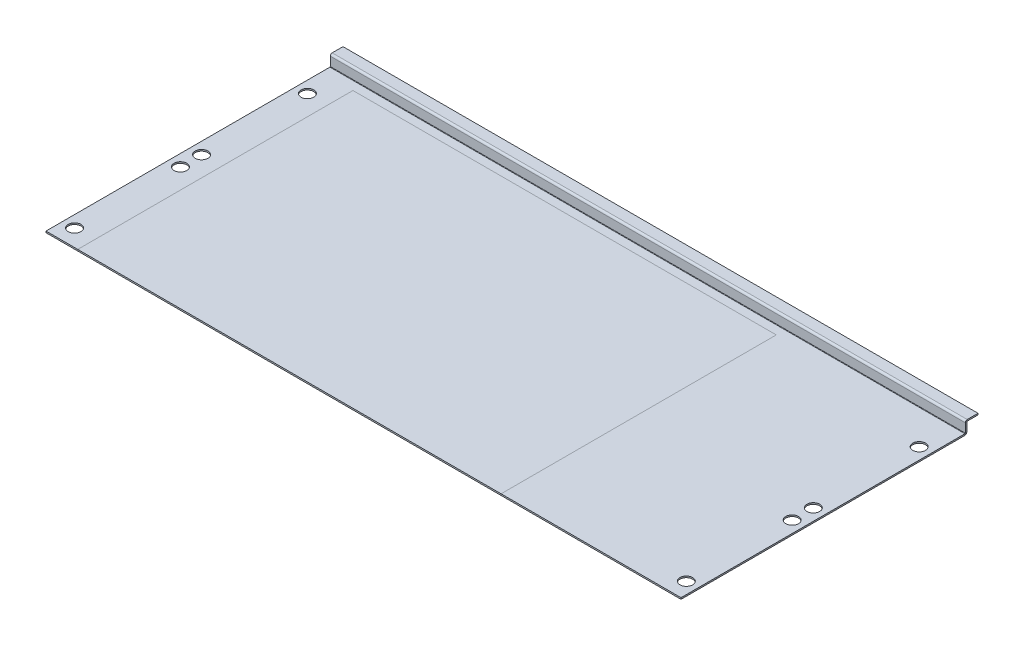
ISO-10303-21;
HEADER;
FILE_DESCRIPTION(('STEP AP214'),'2;1');
FILE_NAME('part.step','',(''),(''),'','','');
FILE_SCHEMA(('AUTOMOTIVE_DESIGN { 1 0 10303 214 1 1 1 1 }'));
ENDSEC;
DATA;
#1=APPLICATION_CONTEXT('core data for automotive mechanical design processes');
#2=APPLICATION_PROTOCOL_DEFINITION('international standard','automotive_design',2000,#1);
#3=PRODUCT_CONTEXT('',#1,'mechanical');
#4=PRODUCT('Part','Part','',(#3));
#5=PRODUCT_RELATED_PRODUCT_CATEGORY('part','',(#4));
#6=PRODUCT_DEFINITION_FORMATION('','',#4);
#7=PRODUCT_DEFINITION_CONTEXT('part definition',#1,'design');
#8=PRODUCT_DEFINITION('design','',#6,#7);
#9=PRODUCT_DEFINITION_SHAPE('','',#8);
#10=(LENGTH_UNIT() NAMED_UNIT(*) SI_UNIT(.MILLI.,.METRE.));
#11=(NAMED_UNIT(*) PLANE_ANGLE_UNIT() SI_UNIT($,.RADIAN.));
#12=(NAMED_UNIT(*) SI_UNIT($,.STERADIAN.) SOLID_ANGLE_UNIT());
#13=UNCERTAINTY_MEASURE_WITH_UNIT(LENGTH_MEASURE(1.E-05),#10,'distance_accuracy_value','');
#14=(GEOMETRIC_REPRESENTATION_CONTEXT(3) GLOBAL_UNCERTAINTY_ASSIGNED_CONTEXT((#13)) GLOBAL_UNIT_ASSIGNED_CONTEXT((#10,
#11,#12)) REPRESENTATION_CONTEXT('',''));
#15=CARTESIAN_POINT('',(0.,0.,0.));
#16=DIRECTION('',(0.,0.,1.));
#17=DIRECTION('',(1.,0.,0.));
#18=AXIS2_PLACEMENT_3D('',#15,#16,#17);
#19=CARTESIAN_POINT('',(65.,-1.41,67.5));
#20=DIRECTION('',(1.,0.,0.));
#21=DIRECTION('',(0.,0.,-1.));
#22=AXIS2_PLACEMENT_3D('',#19,#20,#21);
#23=PLANE('',#22);
#24=DIRECTION('',(0.,1.,0.));
#25=VECTOR('',#24,1.);
#26=CARTESIAN_POINT('',(65.,-1.41,-62.5));
#27=LINE('',#26,#25);
#28=CARTESIAN_POINT('',(65.,-1.4,-62.5));
#29=VERTEX_POINT('',#28);
#30=CARTESIAN_POINT('',(65.,-0.7,-62.5));
#31=VERTEX_POINT('',#30);
#32=EDGE_CURVE('E95',#29,#31,#27,.T.);
#33=ORIENTED_EDGE('',*,*,#32,.F.);
#34=DIRECTION('',(0.,0.,1.));
#35=VECTOR('',#34,1.);
#36=CARTESIAN_POINT('',(65.,-1.4,0.));
#37=LINE('',#36,#35);
#38=CARTESIAN_POINT('',(65.,-1.4,67.5));
#39=VERTEX_POINT('',#38);
#40=EDGE_CURVE('E387',#29,#39,#37,.T.);
#41=ORIENTED_EDGE('',*,*,#40,.T.);
#42=DIRECTION('',(0.,1.,0.));
#43=VECTOR('',#42,1.);
#44=CARTESIAN_POINT('',(65.,-1.41,67.5));
#45=LINE('',#44,#43);
#46=CARTESIAN_POINT('',(65.,-0.7,67.5));
#47=VERTEX_POINT('',#46);
#48=EDGE_CURVE('E103',#39,#47,#45,.T.);
#49=ORIENTED_EDGE('',*,*,#48,.T.);
#50=DIRECTION('',(0.,0.,1.));
#51=VECTOR('',#50,1.);
#52=CARTESIAN_POINT('',(65.,-0.7,0.));
#53=LINE('',#52,#51);
#54=EDGE_CURVE('E111',#31,#47,#53,.T.);
#55=ORIENTED_EDGE('',*,*,#54,.F.);
#56=EDGE_LOOP('',(#33,#41,#49,#55));
#57=FACE_BOUND('',#56,.T.);
#58=ADVANCED_FACE('F87',(#57),#23,.F.);
#59=CARTESIAN_POINT('',(-135.,-1.41,67.5));
#60=DIRECTION('',(-1.,0.,0.));
#61=DIRECTION('',(0.,0.,1.));
#62=AXIS2_PLACEMENT_3D('',#59,#60,#61);
#63=PLANE('',#62);
#64=DIRECTION('',(0.,1.,0.));
#65=VECTOR('',#64,1.);
#66=CARTESIAN_POINT('',(-135.,-1.41,67.5));
#67=LINE('',#66,#65);
#68=CARTESIAN_POINT('',(-135.,-1.4,67.5));
#69=VERTEX_POINT('',#68);
#70=CARTESIAN_POINT('',(-135.,-0.7,67.5));
#71=VERTEX_POINT('',#70);
#72=EDGE_CURVE('E381',#69,#71,#67,.T.);
#73=ORIENTED_EDGE('',*,*,#72,.F.);
#74=DIRECTION('',(0.,0.,-1.));
#75=VECTOR('',#74,1.);
#76=CARTESIAN_POINT('',(-135.,-1.4,0.));
#77=LINE('',#76,#75);
#78=CARTESIAN_POINT('',(-135.,-1.4,-62.5));
#79=VERTEX_POINT('',#78);
#80=EDGE_CURVE('E386',#69,#79,#77,.T.);
#81=ORIENTED_EDGE('',*,*,#80,.T.);
#82=DIRECTION('',(0.,1.,0.));
#83=VECTOR('',#82,1.);
#84=CARTESIAN_POINT('',(-135.,-1.41,-62.5));
#85=LINE('',#84,#83);
#86=CARTESIAN_POINT('',(-135.,-0.7,-62.5));
#87=VERTEX_POINT('',#86);
#88=EDGE_CURVE('E14',#79,#87,#85,.T.);
#89=ORIENTED_EDGE('',*,*,#88,.T.);
#90=DIRECTION('',(0.,0.,-1.));
#91=VECTOR('',#90,1.);
#92=CARTESIAN_POINT('',(-135.,-0.7,0.));
#93=LINE('',#92,#91);
#94=EDGE_CURVE('E392',#71,#87,#93,.T.);
#95=ORIENTED_EDGE('',*,*,#94,.F.);
#96=EDGE_LOOP('',(#73,#81,#89,#95));
#97=FACE_BOUND('',#96,.T.);
#98=ADVANCED_FACE('F433',(#97),#63,.F.);
#99=CARTESIAN_POINT('',(65.,-1.41,-62.5));
#100=DIRECTION('',(0.,0.,-1.));
#101=DIRECTION('',(-1.,0.,0.));
#102=AXIS2_PLACEMENT_3D('',#99,#100,#101);
#103=PLANE('',#102);
#104=ORIENTED_EDGE('',*,*,#88,.F.);
#105=DIRECTION('',(1.,0.,0.));
#106=VECTOR('',#105,1.);
#107=CARTESIAN_POINT('',(0.,-1.4,-62.5));
#108=LINE('',#107,#106);
#109=EDGE_CURVE('E383',#79,#29,#108,.T.);
#110=ORIENTED_EDGE('',*,*,#109,.T.);
#111=ORIENTED_EDGE('',*,*,#32,.T.);
#112=DIRECTION('',(1.,0.,0.));
#113=VECTOR('',#112,1.);
#114=CARTESIAN_POINT('',(0.,-0.7,-62.5));
#115=LINE('',#114,#113);
#116=EDGE_CURVE('E90',#87,#31,#115,.T.);
#117=ORIENTED_EDGE('',*,*,#116,.F.);
#118=EDGE_LOOP('',(#104,#110,#111,#117));
#119=FACE_BOUND('',#118,.T.);
#120=ADVANCED_FACE('F401',(#119),#103,.F.);
#121=CARTESIAN_POINT('',(150.,4.6,-72.8000000000001));
#122=DIRECTION('',(0.,0.,1.));
#123=DIRECTION('',(0.,1.,0.));
#124=AXIS2_PLACEMENT_3D('',#121,#122,#123);
#125=PLANE('',#124);
#126=DIRECTION('',(-1.,0.,0.));
#127=VECTOR('',#126,1.);
#128=CARTESIAN_POINT('',(150.,3.9,-72.8000000000001));
#129=LINE('',#128,#127);
#130=CARTESIAN_POINT('',(-150.,3.9,-72.8));
#131=VERTEX_POINT('',#130);
#132=CARTESIAN_POINT('',(150.,3.9,-72.8000000000001));
#133=VERTEX_POINT('',#132);
#134=EDGE_CURVE('E230',#131,#133,#129,.F.);
#135=ORIENTED_EDGE('',*,*,#134,.F.);
#136=DIRECTION('',(0.,-1.,0.));
#137=VECTOR('',#136,1.);
#138=CARTESIAN_POINT('',(-150.,4.6,-72.8));
#139=LINE('',#138,#137);
#140=CARTESIAN_POINT('',(-150.,4.6,-72.8));
#141=VERTEX_POINT('',#140);
#142=EDGE_CURVE('E208',#141,#131,#139,.T.);
#143=ORIENTED_EDGE('',*,*,#142,.F.);
#144=DIRECTION('',(1.,0.,0.));
#145=VECTOR('',#144,1.);
#146=CARTESIAN_POINT('',(0.,4.6,-72.8000000000001));
#147=LINE('',#146,#145);
#148=CARTESIAN_POINT('',(150.,4.6,-72.8000000000001));
#149=VERTEX_POINT('',#148);
#150=EDGE_CURVE('E201',#141,#149,#147,.T.);
#151=ORIENTED_EDGE('',*,*,#150,.T.);
#152=DIRECTION('',(0.,-1.,0.));
#153=VECTOR('',#152,1.);
#154=CARTESIAN_POINT('',(150.,4.6,-72.8000000000001));
#155=LINE('',#154,#153);
#156=EDGE_CURVE('E205',#149,#133,#155,.T.);
#157=ORIENTED_EDGE('',*,*,#156,.T.);
#158=EDGE_LOOP('',(#135,#143,#151,#157));
#159=FACE_BOUND('',#158,.T.);
#160=ADVANCED_FACE('F203',(#159),#125,.F.);
#161=CARTESIAN_POINT('',(150.,4.6,-67.5000000000001));
#162=DIRECTION('',(-1.,0.,0.));
#163=DIRECTION('',(0.,1.,0.));
#164=AXIS2_PLACEMENT_3D('',#161,#162,#163);
#165=PLANE('',#164);
#166=DIRECTION('',(0.,-1.,0.));
#167=VECTOR('',#166,1.);
#168=CARTESIAN_POINT('',(150.,4.6,-67.7000000000001));
#169=LINE('',#168,#167);
#170=CARTESIAN_POINT('',(150.,3.90000000000001,-67.7000000000001));
#171=VERTEX_POINT('',#170);
#172=CARTESIAN_POINT('',(150.,4.60000000000001,-67.7000000000001));
#173=VERTEX_POINT('',#172);
#174=EDGE_CURVE('E242',#171,#173,#169,.F.);
#175=ORIENTED_EDGE('',*,*,#174,.F.);
#176=DIRECTION('',(0.,0.,-1.));
#177=VECTOR('',#176,1.);
#178=CARTESIAN_POINT('',(150.,3.9,-67.5000000000001));
#179=LINE('',#178,#177);
#180=EDGE_CURVE('E223',#133,#171,#179,.F.);
#181=ORIENTED_EDGE('',*,*,#180,.F.);
#182=ORIENTED_EDGE('',*,*,#156,.F.);
#183=DIRECTION('',(0.,0.,1.));
#184=VECTOR('',#183,1.);
#185=CARTESIAN_POINT('',(150.,4.59999999999994,0.));
#186=LINE('',#185,#184);
#187=EDGE_CURVE('E211',#149,#173,#186,.T.);
#188=ORIENTED_EDGE('',*,*,#187,.T.);
#189=EDGE_LOOP('',(#175,#181,#182,#188));
#190=FACE_BOUND('',#189,.T.);
#191=ADVANCED_FACE('F222',(#190),#165,.F.);
#192=CARTESIAN_POINT('',(-150.,4.6,-72.8));
#193=DIRECTION('',(1.,0.,0.));
#194=DIRECTION('',(0.,-1.,0.));
#195=AXIS2_PLACEMENT_3D('',#192,#193,#194);
#196=PLANE('',#195);
#197=DIRECTION('',(0.,-1.,0.));
#198=VECTOR('',#197,1.);
#199=CARTESIAN_POINT('',(-150.,3.90000000000001,-67.7));
#200=LINE('',#199,#198);
#201=CARTESIAN_POINT('',(-150.,3.90000000000001,-67.7000000000001));
#202=VERTEX_POINT('',#201);
#203=CARTESIAN_POINT('',(-150.,4.6,-67.7));
#204=VERTEX_POINT('',#203);
#205=EDGE_CURVE('E236',#202,#204,#200,.F.);
#206=ORIENTED_EDGE('',*,*,#205,.T.);
#207=DIRECTION('',(0.,0.,-1.));
#208=VECTOR('',#207,1.);
#209=CARTESIAN_POINT('',(-150.,4.59999999999994,0.));
#210=LINE('',#209,#208);
#211=EDGE_CURVE('E212',#204,#141,#210,.T.);
#212=ORIENTED_EDGE('',*,*,#211,.T.);
#213=ORIENTED_EDGE('',*,*,#142,.T.);
#214=DIRECTION('',(0.,0.,1.));
#215=VECTOR('',#214,1.);
#216=CARTESIAN_POINT('',(-150.,3.9,-72.8));
#217=LINE('',#216,#215);
#218=EDGE_CURVE('E232',#202,#131,#217,.F.);
#219=ORIENTED_EDGE('',*,*,#218,.F.);
#220=EDGE_LOOP('',(#206,#212,#213,#219));
#221=FACE_BOUND('',#220,.T.);
#222=ADVANCED_FACE('F470',(#221),#196,.F.);
#223=CARTESIAN_POINT('',(0.,4.59999999999994,0.));
#224=DIRECTION('',(0.,-1.,0.));
#225=DIRECTION('',(0.,0.,1.));
#226=AXIS2_PLACEMENT_3D('',#223,#224,#225);
#227=PLANE('',#226);
#228=DIRECTION('',(-1.,0.,0.));
#229=VECTOR('',#228,1.);
#230=CARTESIAN_POINT('',(150.,4.6,-67.7000000000001));
#231=LINE('',#230,#229);
#232=EDGE_CURVE('E217',#204,#173,#231,.F.);
#233=ORIENTED_EDGE('',*,*,#232,.T.);
#234=ORIENTED_EDGE('',*,*,#187,.F.);
#235=ORIENTED_EDGE('',*,*,#150,.F.);
#236=ORIENTED_EDGE('',*,*,#211,.F.);
#237=EDGE_LOOP('',(#233,#234,#235,#236));
#238=FACE_BOUND('',#237,.T.);
#239=ADVANCED_FACE('F215',(#238),#227,.F.);
#240=CARTESIAN_POINT('',(0.,3.89999999999994,0.));
#241=DIRECTION('',(0.,-1.,0.));
#242=DIRECTION('',(0.,0.,1.));
#243=AXIS2_PLACEMENT_3D('',#240,#241,#242);
#244=PLANE('',#243);
#245=ORIENTED_EDGE('',*,*,#218,.T.);
#246=ORIENTED_EDGE('',*,*,#134,.T.);
#247=ORIENTED_EDGE('',*,*,#180,.T.);
#248=DIRECTION('',(-1.,0.,0.));
#249=VECTOR('',#248,1.);
#250=CARTESIAN_POINT('',(150.,3.90000000000001,-67.7000000000001));
#251=LINE('',#250,#249);
#252=EDGE_CURVE('E239',#171,#202,#251,.T.);
#253=ORIENTED_EDGE('',*,*,#252,.T.);
#254=EDGE_LOOP('',(#245,#246,#247,#253));
#255=FACE_BOUND('',#254,.T.);
#256=ADVANCED_FACE('F472',(#255),#244,.T.);
#257=CARTESIAN_POINT('',(150.,3.70000000000001,-67.7000000000001));
#258=DIRECTION('',(1.,0.,0.));
#259=DIRECTION('',(0.,0.,-1.));
#260=AXIS2_PLACEMENT_3D('',#257,#258,#259);
#261=PLANE('',#260);
#262=ORIENTED_EDGE('',*,*,#174,.T.);
#263=CARTESIAN_POINT('',(150.,3.70000000000001,-67.7000000000001));
#264=DIRECTION('',(1.,0.,0.));
#265=DIRECTION('',(0.,0.,1.));
#266=AXIS2_PLACEMENT_3D('',#263,#264,#265);
#267=CIRCLE('',#266,0.9);
#268=CARTESIAN_POINT('',(150.,3.70000000000001,-66.8000000000001));
#269=VERTEX_POINT('',#268);
#270=EDGE_CURVE('E248',#269,#173,#267,.F.);
#271=ORIENTED_EDGE('',*,*,#270,.F.);
#272=DIRECTION('',(0.,0.,1.));
#273=VECTOR('',#272,1.);
#274=CARTESIAN_POINT('',(150.,3.70000000000001,-67.5000000000001));
#275=LINE('',#274,#273);
#276=CARTESIAN_POINT('',(150.,3.70000000000001,-67.5000000000001));
#277=VERTEX_POINT('',#276);
#278=EDGE_CURVE('E260',#277,#269,#275,.T.);
#279=ORIENTED_EDGE('',*,*,#278,.F.);
#280=CARTESIAN_POINT('',(150.,3.70000000000001,-67.7000000000001));
#281=DIRECTION('',(1.,0.,0.));
#282=DIRECTION('',(0.,0.,1.));
#283=AXIS2_PLACEMENT_3D('',#280,#281,#282);
#284=CIRCLE('',#283,0.200000000000001);
#285=EDGE_CURVE('E253',#277,#171,#284,.F.);
#286=ORIENTED_EDGE('',*,*,#285,.T.);
#287=EDGE_LOOP('',(#262,#271,#279,#286));
#288=FACE_BOUND('',#287,.T.);
#289=ADVANCED_FACE('F466',(#288),#261,.T.);
#290=CARTESIAN_POINT('',(-150.,3.70000000000001,-67.7000000000001));
#291=DIRECTION('',(1.,0.,0.));
#292=DIRECTION('',(0.,0.,-1.));
#293=AXIS2_PLACEMENT_3D('',#290,#291,#292);
#294=PLANE('',#293);
#295=CARTESIAN_POINT('',(-150.,3.70000000000001,-67.7000000000001));
#296=DIRECTION('',(1.,0.,0.));
#297=DIRECTION('',(0.,0.,1.));
#298=AXIS2_PLACEMENT_3D('',#295,#296,#297);
#299=CIRCLE('',#298,0.200000000000001);
#300=CARTESIAN_POINT('',(-150.,3.70000000000001,-67.5000000000001));
#301=VERTEX_POINT('',#300);
#302=EDGE_CURVE('E225',#202,#301,#299,.T.);
#303=ORIENTED_EDGE('',*,*,#302,.T.);
#304=DIRECTION('',(0.,0.,1.));
#305=VECTOR('',#304,1.);
#306=CARTESIAN_POINT('',(-150.,3.70000000000001,-67.5000000000001));
#307=LINE('',#306,#305);
#308=CARTESIAN_POINT('',(-150.,3.70000000000001,-66.8000000000001));
#309=VERTEX_POINT('',#308);
#310=EDGE_CURVE('E251',#301,#309,#307,.T.);
#311=ORIENTED_EDGE('',*,*,#310,.T.);
#312=CARTESIAN_POINT('',(-150.,3.70000000000001,-67.7000000000001));
#313=DIRECTION('',(1.,0.,0.));
#314=DIRECTION('',(0.,0.,1.));
#315=AXIS2_PLACEMENT_3D('',#312,#313,#314);
#316=CIRCLE('',#315,0.9);
#317=EDGE_CURVE('E249',#204,#309,#316,.T.);
#318=ORIENTED_EDGE('',*,*,#317,.F.);
#319=ORIENTED_EDGE('',*,*,#205,.F.);
#320=EDGE_LOOP('',(#303,#311,#318,#319));
#321=FACE_BOUND('',#320,.T.);
#322=ADVANCED_FACE('F459',(#321),#294,.F.);
#323=CARTESIAN_POINT('',(-150.,3.70000000000001,-67.7000000000001));
#324=DIRECTION('',(-1.,0.,0.));
#325=DIRECTION('',(0.,1.,0.));
#326=AXIS2_PLACEMENT_3D('',#323,#324,#325);
#327=CYLINDRICAL_SURFACE('',#326,0.9);
#328=DIRECTION('',(-1.,0.,0.));
#329=VECTOR('',#328,1.);
#330=CARTESIAN_POINT('',(-150.,3.70000000000001,-66.8000000000001));
#331=LINE('',#330,#329);
#332=EDGE_CURVE('E245',#309,#269,#331,.F.);
#333=ORIENTED_EDGE('',*,*,#332,.T.);
#334=ORIENTED_EDGE('',*,*,#270,.T.);
#335=ORIENTED_EDGE('',*,*,#232,.F.);
#336=ORIENTED_EDGE('',*,*,#317,.T.);
#337=EDGE_LOOP('',(#333,#334,#335,#336));
#338=FACE_BOUND('',#337,.T.);
#339=ADVANCED_FACE('F468',(#338),#327,.T.);
#340=CARTESIAN_POINT('',(-150.,3.70000000000001,-67.7000000000001));
#341=DIRECTION('',(-1.,0.,0.));
#342=DIRECTION('',(0.,1.,0.));
#343=AXIS2_PLACEMENT_3D('',#340,#341,#342);
#344=CYLINDRICAL_SURFACE('',#343,0.200000000000001);
#345=DIRECTION('',(-1.,0.,0.));
#346=VECTOR('',#345,1.);
#347=CARTESIAN_POINT('',(-150.,3.70000000000001,-67.5000000000001));
#348=LINE('',#347,#346);
#349=EDGE_CURVE('E256',#301,#277,#348,.F.);
#350=ORIENTED_EDGE('',*,*,#349,.F.);
#351=ORIENTED_EDGE('',*,*,#302,.F.);
#352=ORIENTED_EDGE('',*,*,#252,.F.);
#353=ORIENTED_EDGE('',*,*,#285,.F.);
#354=EDGE_LOOP('',(#350,#351,#352,#353));
#355=FACE_BOUND('',#354,.T.);
#356=ADVANCED_FACE('F464',(#355),#344,.F.);
#357=CARTESIAN_POINT('',(150.,4.6,-67.5000000000001));
#358=DIRECTION('',(-1.,0.,0.));
#359=DIRECTION('',(0.,0.,1.));
#360=AXIS2_PLACEMENT_3D('',#357,#358,#359);
#361=PLANE('',#360);
#362=ORIENTED_EDGE('',*,*,#278,.T.);
#363=DIRECTION('',(0.,-1.,0.));
#364=VECTOR('',#363,1.);
#365=CARTESIAN_POINT('',(150.,4.6,-66.8000000000001));
#366=LINE('',#365,#364);
#367=CARTESIAN_POINT('',(150.,-0.49999999999998,-66.8));
#368=VERTEX_POINT('',#367);
#369=EDGE_CURVE('E276',#368,#269,#366,.F.);
#370=ORIENTED_EDGE('',*,*,#369,.F.);
#371=DIRECTION('',(0.,0.,1.));
#372=VECTOR('',#371,1.);
#373=CARTESIAN_POINT('',(150.,-0.499999999999974,-66.8000000000001));
#374=LINE('',#373,#372);
#375=CARTESIAN_POINT('',(150.,-0.499999999999979,-67.5000000000001));
#376=VERTEX_POINT('',#375);
#377=EDGE_CURVE('E282',#368,#376,#374,.F.);
#378=ORIENTED_EDGE('',*,*,#377,.T.);
#379=DIRECTION('',(0.,1.,0.));
#380=VECTOR('',#379,1.);
#381=CARTESIAN_POINT('',(150.,-1.40000000000018,-67.5000000000001));
#382=LINE('',#381,#380);
#383=EDGE_CURVE('E270',#376,#277,#382,.T.);
#384=ORIENTED_EDGE('',*,*,#383,.T.);
#385=EDGE_LOOP('',(#362,#370,#378,#384));
#386=FACE_BOUND('',#385,.T.);
#387=ADVANCED_FACE('F448',(#386),#361,.F.);
#388=CARTESIAN_POINT('',(-150.,-0.700000000000002,-67.5));
#389=DIRECTION('',(1.,0.,0.));
#390=DIRECTION('',(0.,0.,-1.));
#391=AXIS2_PLACEMENT_3D('',#388,#389,#390);
#392=PLANE('',#391);
#393=ORIENTED_EDGE('',*,*,#310,.F.);
#394=DIRECTION('',(0.,-1.,0.));
#395=VECTOR('',#394,1.);
#396=CARTESIAN_POINT('',(-150.,-1.40000000000018,-67.5));
#397=LINE('',#396,#395);
#398=CARTESIAN_POINT('',(-150.,-0.499999999999982,-67.5));
#399=VERTEX_POINT('',#398);
#400=EDGE_CURVE('E266',#301,#399,#397,.T.);
#401=ORIENTED_EDGE('',*,*,#400,.T.);
#402=DIRECTION('',(0.,0.,1.));
#403=VECTOR('',#402,1.);
#404=CARTESIAN_POINT('',(-150.,-0.499999999999993,-67.5));
#405=LINE('',#404,#403);
#406=CARTESIAN_POINT('',(-150.,-0.49999999999998,-66.8));
#407=VERTEX_POINT('',#406);
#408=EDGE_CURVE('E263',#407,#399,#405,.F.);
#409=ORIENTED_EDGE('',*,*,#408,.F.);
#410=DIRECTION('',(0.,1.,0.));
#411=VECTOR('',#410,1.);
#412=CARTESIAN_POINT('',(-150.,-0.700000000000001,-66.8));
#413=LINE('',#412,#411);
#414=EDGE_CURVE('E273',#309,#407,#413,.F.);
#415=ORIENTED_EDGE('',*,*,#414,.F.);
#416=EDGE_LOOP('',(#393,#401,#409,#415));
#417=FACE_BOUND('',#416,.T.);
#418=ADVANCED_FACE('F456',(#417),#392,.F.);
#419=CARTESIAN_POINT('',(0.,-1.40000000000018,-66.8));
#420=DIRECTION('',(0.,0.,1.));
#421=DIRECTION('',(0.,1.,0.));
#422=AXIS2_PLACEMENT_3D('',#419,#420,#421);
#423=PLANE('',#422);
#424=ORIENTED_EDGE('',*,*,#414,.T.);
#425=DIRECTION('',(1.,0.,0.));
#426=VECTOR('',#425,1.);
#427=CARTESIAN_POINT('',(-150.,-0.499999999999988,-66.8));
#428=LINE('',#427,#426);
#429=EDGE_CURVE('E285',#407,#368,#428,.T.);
#430=ORIENTED_EDGE('',*,*,#429,.T.);
#431=ORIENTED_EDGE('',*,*,#369,.T.);
#432=ORIENTED_EDGE('',*,*,#332,.F.);
#433=EDGE_LOOP('',(#424,#430,#431,#432));
#434=FACE_BOUND('',#433,.T.);
#435=ADVANCED_FACE('F451',(#434),#423,.T.);
#436=CARTESIAN_POINT('',(0.,-1.40000000000018,-67.5));
#437=DIRECTION('',(0.,0.,1.));
#438=DIRECTION('',(0.,1.,0.));
#439=AXIS2_PLACEMENT_3D('',#436,#437,#438);
#440=PLANE('',#439);
#441=ORIENTED_EDGE('',*,*,#349,.T.);
#442=ORIENTED_EDGE('',*,*,#383,.F.);
#443=DIRECTION('',(1.,0.,0.));
#444=VECTOR('',#443,1.);
#445=CARTESIAN_POINT('',(-150.,-0.499999999999993,-67.5));
#446=LINE('',#445,#444);
#447=EDGE_CURVE('E279',#376,#399,#446,.F.);
#448=ORIENTED_EDGE('',*,*,#447,.T.);
#449=ORIENTED_EDGE('',*,*,#400,.F.);
#450=EDGE_LOOP('',(#441,#442,#448,#449));
#451=FACE_BOUND('',#450,.T.);
#452=ADVANCED_FACE('F444',(#451),#440,.F.);
#453=CARTESIAN_POINT('',(150.,-0.49999999999998,-66.6));
#454=DIRECTION('',(-1.,0.,0.));
#455=DIRECTION('',(0.,0.,1.));
#456=AXIS2_PLACEMENT_3D('',#453,#454,#455);
#457=PLANE('',#456);
#458=CARTESIAN_POINT('',(150.,-0.49999999999998,-66.6));
#459=DIRECTION('',(-1.,0.,0.));
#460=DIRECTION('',(0.,0.,-1.));
#461=AXIS2_PLACEMENT_3D('',#458,#459,#460);
#462=CIRCLE('',#461,0.199999999999978);
#463=CARTESIAN_POINT('',(150.,-0.699999999999958,-66.6000000000001));
#464=VERTEX_POINT('',#463);
#465=EDGE_CURVE('E269',#368,#464,#462,.T.);
#466=ORIENTED_EDGE('',*,*,#465,.T.);
#467=DIRECTION('',(0.,-1.,-1.3877787807816E-13));
#468=VECTOR('',#467,1.);
#469=CARTESIAN_POINT('',(150.,-0.699999999999958,-66.6000000000001));
#470=LINE('',#469,#468);
#471=CARTESIAN_POINT('',(150.,-1.39999999999996,-66.6000000000002));
#472=VERTEX_POINT('',#471);
#473=EDGE_CURVE('E296',#464,#472,#470,.T.);
#474=ORIENTED_EDGE('',*,*,#473,.T.);
#475=CARTESIAN_POINT('',(150.,-0.49999999999998,-66.6));
#476=DIRECTION('',(-1.,0.,0.));
#477=DIRECTION('',(0.,0.,-1.));
#478=AXIS2_PLACEMENT_3D('',#475,#476,#477);
#479=CIRCLE('',#478,0.899999999999978);
#480=EDGE_CURVE('E294',#376,#472,#479,.T.);
#481=ORIENTED_EDGE('',*,*,#480,.F.);
#482=ORIENTED_EDGE('',*,*,#377,.F.);
#483=EDGE_LOOP('',(#466,#474,#481,#482));
#484=FACE_BOUND('',#483,.T.);
#485=ADVANCED_FACE('F414',(#484),#457,.F.);
#486=CARTESIAN_POINT('',(-150.,-0.49999999999998,-66.6));
#487=DIRECTION('',(-1.,0.,0.));
#488=DIRECTION('',(0.,0.,1.));
#489=AXIS2_PLACEMENT_3D('',#486,#487,#488);
#490=PLANE('',#489);
#491=ORIENTED_EDGE('',*,*,#408,.T.);
#492=CARTESIAN_POINT('',(-150.,-0.49999999999998,-66.6));
#493=DIRECTION('',(-1.,0.,0.));
#494=DIRECTION('',(0.,0.,-1.));
#495=AXIS2_PLACEMENT_3D('',#492,#493,#494);
#496=CIRCLE('',#495,0.899999999999978);
#497=CARTESIAN_POINT('',(-150.,-1.4,-66.6000000000001));
#498=VERTEX_POINT('',#497);
#499=EDGE_CURVE('E293',#498,#399,#496,.F.);
#500=ORIENTED_EDGE('',*,*,#499,.F.);
#501=DIRECTION('',(0.,-1.,-1.3877787807816E-13));
#502=VECTOR('',#501,1.);
#503=CARTESIAN_POINT('',(-150.,-0.699999999999958,-66.6000000000001));
#504=LINE('',#503,#502);
#505=CARTESIAN_POINT('',(-150.,-0.699999999999958,-66.6000000000001));
#506=VERTEX_POINT('',#505);
#507=EDGE_CURVE('E304',#506,#498,#504,.T.);
#508=ORIENTED_EDGE('',*,*,#507,.F.);
#509=CARTESIAN_POINT('',(-150.,-0.49999999999998,-66.6));
#510=DIRECTION('',(-1.,0.,0.));
#511=DIRECTION('',(0.,0.,-1.));
#512=AXIS2_PLACEMENT_3D('',#509,#510,#511);
#513=CIRCLE('',#512,0.199999999999978);
#514=EDGE_CURVE('E298',#506,#407,#513,.F.);
#515=ORIENTED_EDGE('',*,*,#514,.T.);
#516=EDGE_LOOP('',(#491,#500,#508,#515));
#517=FACE_BOUND('',#516,.T.);
#518=ADVANCED_FACE('F424',(#517),#490,.T.);
#519=CARTESIAN_POINT('',(150.,-0.49999999999998,-66.6));
#520=DIRECTION('',(1.,0.,0.));
#521=DIRECTION('',(0.,0.,-1.));
#522=AXIS2_PLACEMENT_3D('',#519,#520,#521);
#523=CYLINDRICAL_SURFACE('',#522,0.199999999999978);
#524=DIRECTION('',(1.,0.,0.));
#525=VECTOR('',#524,1.);
#526=CARTESIAN_POINT('',(150.,-0.699999999999958,-66.6000000000001));
#527=LINE('',#526,#525);
#528=EDGE_CURVE('E300',#464,#506,#527,.F.);
#529=ORIENTED_EDGE('',*,*,#528,.F.);
#530=ORIENTED_EDGE('',*,*,#465,.F.);
#531=ORIENTED_EDGE('',*,*,#429,.F.);
#532=ORIENTED_EDGE('',*,*,#514,.F.);
#533=EDGE_LOOP('',(#529,#530,#531,#532));
#534=FACE_BOUND('',#533,.T.);
#535=ADVANCED_FACE('F420',(#534),#523,.F.);
#536=CARTESIAN_POINT('',(-144.5,-0.7,59.5));
#537=DIRECTION('',(0.,-1.,0.));
#538=DIRECTION('',(0.,0.,1.));
#539=AXIS2_PLACEMENT_3D('',#536,#537,#538);
#540=CYLINDRICAL_SURFACE('',#539,2.99999999999999);
#541=CARTESIAN_POINT('',(-144.5,-0.7,59.5));
#542=DIRECTION('',(0.,1.,0.));
#543=DIRECTION('',(0.,0.,1.));
#544=AXIS2_PLACEMENT_3D('',#541,#542,#543);
#545=CIRCLE('',#544,2.99999999999999);
#546=CARTESIAN_POINT('',(-144.5,-0.7,62.5));
#547=VERTEX_POINT('',#546);
#548=EDGE_CURVE('E352',#547,#547,#545,.T.);
#549=ORIENTED_EDGE('',*,*,#548,.T.);
#550=EDGE_LOOP('',(#549));
#551=FACE_BOUND('',#550,.T.);
#552=CARTESIAN_POINT('',(-144.5,-1.4,59.5));
#553=DIRECTION('',(0.,1.,0.));
#554=DIRECTION('',(0.,0.,1.));
#555=AXIS2_PLACEMENT_3D('',#552,#553,#554);
#556=CIRCLE('',#555,2.99999999999999);
#557=CARTESIAN_POINT('',(-144.5,-1.4,62.5));
#558=VERTEX_POINT('',#557);
#559=EDGE_CURVE('E349',#558,#558,#556,.T.);
#560=ORIENTED_EDGE('',*,*,#559,.F.);
#561=EDGE_LOOP('',(#560));
#562=FACE_BOUND('',#561,.T.);
#563=ADVANCED_FACE('F502',(#551,#562),#540,.F.);
#564=CARTESIAN_POINT('',(-144.5,-0.7,9.5));
#565=DIRECTION('',(0.,-1.,0.));
#566=DIRECTION('',(0.,0.,1.));
#567=AXIS2_PLACEMENT_3D('',#564,#565,#566);
#568=CYLINDRICAL_SURFACE('',#567,2.99999999999999);
#569=CARTESIAN_POINT('',(-144.5,-0.7,9.5));
#570=DIRECTION('',(0.,1.,0.));
#571=DIRECTION('',(0.,0.,1.));
#572=AXIS2_PLACEMENT_3D('',#569,#570,#571);
#573=CIRCLE('',#572,2.99999999999999);
#574=CARTESIAN_POINT('',(-144.5,-0.7,12.5));
#575=VERTEX_POINT('',#574);
#576=EDGE_CURVE('E346',#575,#575,#573,.T.);
#577=ORIENTED_EDGE('',*,*,#576,.T.);
#578=EDGE_LOOP('',(#577));
#579=FACE_BOUND('',#578,.T.);
#580=CARTESIAN_POINT('',(-144.5,-1.4,9.5));
#581=DIRECTION('',(0.,1.,0.));
#582=DIRECTION('',(0.,0.,1.));
#583=AXIS2_PLACEMENT_3D('',#580,#581,#582);
#584=CIRCLE('',#583,2.99999999999999);
#585=CARTESIAN_POINT('',(-144.5,-1.4,12.5));
#586=VERTEX_POINT('',#585);
#587=EDGE_CURVE('E343',#586,#586,#584,.T.);
#588=ORIENTED_EDGE('',*,*,#587,.F.);
#589=EDGE_LOOP('',(#588));
#590=FACE_BOUND('',#589,.T.);
#591=ADVANCED_FACE('F505',(#579,#590),#568,.F.);
#592=CARTESIAN_POINT('',(-144.5,-0.7,-0.499999999999999));
#593=DIRECTION('',(0.,-1.,0.));
#594=DIRECTION('',(0.,0.,1.));
#595=AXIS2_PLACEMENT_3D('',#592,#593,#594);
#596=CYLINDRICAL_SURFACE('',#595,2.99999999999999);
#597=CARTESIAN_POINT('',(-144.5,-0.7,-0.499999999999999));
#598=DIRECTION('',(0.,1.,0.));
#599=DIRECTION('',(0.,0.,1.));
#600=AXIS2_PLACEMENT_3D('',#597,#598,#599);
#601=CIRCLE('',#600,2.99999999999999);
#602=CARTESIAN_POINT('',(-144.5,-0.7,2.5));
#603=VERTEX_POINT('',#602);
#604=EDGE_CURVE('E340',#603,#603,#601,.T.);
#605=ORIENTED_EDGE('',*,*,#604,.T.);
#606=EDGE_LOOP('',(#605));
#607=FACE_BOUND('',#606,.T.);
#608=CARTESIAN_POINT('',(-144.5,-1.4,-0.499999999999999));
#609=DIRECTION('',(0.,1.,0.));
#610=DIRECTION('',(0.,0.,1.));
#611=AXIS2_PLACEMENT_3D('',#608,#609,#610);
#612=CIRCLE('',#611,2.99999999999999);
#613=CARTESIAN_POINT('',(-144.5,-1.4,2.5));
#614=VERTEX_POINT('',#613);
#615=EDGE_CURVE('E337',#614,#614,#612,.T.);
#616=ORIENTED_EDGE('',*,*,#615,.F.);
#617=EDGE_LOOP('',(#616));
#618=FACE_BOUND('',#617,.T.);
#619=ADVANCED_FACE('F509',(#607,#618),#596,.F.);
#620=CARTESIAN_POINT('',(-144.5,-0.7,-50.5));
#621=DIRECTION('',(0.,-1.,0.));
#622=DIRECTION('',(0.,0.,1.));
#623=AXIS2_PLACEMENT_3D('',#620,#621,#622);
#624=CYLINDRICAL_SURFACE('',#623,2.99999999999999);
#625=CARTESIAN_POINT('',(-144.5,-0.7,-50.5));
#626=DIRECTION('',(0.,1.,0.));
#627=DIRECTION('',(0.,0.,1.));
#628=AXIS2_PLACEMENT_3D('',#625,#626,#627);
#629=CIRCLE('',#628,2.99999999999999);
#630=CARTESIAN_POINT('',(-144.5,-0.7,-47.5));
#631=VERTEX_POINT('',#630);
#632=EDGE_CURVE('E334',#631,#631,#629,.T.);
#633=ORIENTED_EDGE('',*,*,#632,.T.);
#634=EDGE_LOOP('',(#633));
#635=FACE_BOUND('',#634,.T.);
#636=CARTESIAN_POINT('',(-144.5,-1.4,-50.5));
#637=DIRECTION('',(0.,1.,0.));
#638=DIRECTION('',(0.,0.,1.));
#639=AXIS2_PLACEMENT_3D('',#636,#637,#638);
#640=CIRCLE('',#639,2.99999999999999);
#641=CARTESIAN_POINT('',(-144.5,-1.4,-47.5));
#642=VERTEX_POINT('',#641);
#643=EDGE_CURVE('E331',#642,#642,#640,.T.);
#644=ORIENTED_EDGE('',*,*,#643,.F.);
#645=EDGE_LOOP('',(#644));
#646=FACE_BOUND('',#645,.T.);
#647=ADVANCED_FACE('F513',(#635,#646),#624,.F.);
#648=CARTESIAN_POINT('',(144.5,-0.7,59.5));
#649=DIRECTION('',(0.,-1.,0.));
#650=DIRECTION('',(0.,0.,1.));
#651=AXIS2_PLACEMENT_3D('',#648,#649,#650);
#652=CYLINDRICAL_SURFACE('',#651,2.99999999999999);
#653=CARTESIAN_POINT('',(144.5,-0.7,59.5));
#654=DIRECTION('',(0.,1.,0.));
#655=DIRECTION('',(0.,0.,-1.));
#656=AXIS2_PLACEMENT_3D('',#653,#654,#655);
#657=CIRCLE('',#656,2.99999999999999);
#658=CARTESIAN_POINT('',(144.5,-0.7,56.5));
#659=VERTEX_POINT('',#658);
#660=EDGE_CURVE('E328',#659,#659,#657,.T.);
#661=ORIENTED_EDGE('',*,*,#660,.T.);
#662=EDGE_LOOP('',(#661));
#663=FACE_BOUND('',#662,.T.);
#664=CARTESIAN_POINT('',(144.5,-1.4,59.5));
#665=DIRECTION('',(0.,1.,0.));
#666=DIRECTION('',(0.,0.,-1.));
#667=AXIS2_PLACEMENT_3D('',#664,#665,#666);
#668=CIRCLE('',#667,2.99999999999999);
#669=CARTESIAN_POINT('',(144.5,-1.4,56.5));
#670=VERTEX_POINT('',#669);
#671=EDGE_CURVE('E325',#670,#670,#668,.T.);
#672=ORIENTED_EDGE('',*,*,#671,.F.);
#673=EDGE_LOOP('',(#672));
#674=FACE_BOUND('',#673,.T.);
#675=ADVANCED_FACE('F517',(#663,#674),#652,.F.);
#676=CARTESIAN_POINT('',(144.5,-0.7,9.49999999999997));
#677=DIRECTION('',(0.,-1.,0.));
#678=DIRECTION('',(0.,0.,1.));
#679=AXIS2_PLACEMENT_3D('',#676,#677,#678);
#680=CYLINDRICAL_SURFACE('',#679,2.99999999999999);
#681=CARTESIAN_POINT('',(144.5,-0.7,9.49999999999997));
#682=DIRECTION('',(0.,1.,0.));
#683=DIRECTION('',(0.,0.,-1.));
#684=AXIS2_PLACEMENT_3D('',#681,#682,#683);
#685=CIRCLE('',#684,2.99999999999999);
#686=CARTESIAN_POINT('',(144.5,-0.7,6.49999999999997));
#687=VERTEX_POINT('',#686);
#688=EDGE_CURVE('E322',#687,#687,#685,.T.);
#689=ORIENTED_EDGE('',*,*,#688,.T.);
#690=EDGE_LOOP('',(#689));
#691=FACE_BOUND('',#690,.T.);
#692=CARTESIAN_POINT('',(144.5,-1.4,9.49999999999997));
#693=DIRECTION('',(0.,1.,0.));
#694=DIRECTION('',(0.,0.,-1.));
#695=AXIS2_PLACEMENT_3D('',#692,#693,#694);
#696=CIRCLE('',#695,2.99999999999999);
#697=CARTESIAN_POINT('',(144.5,-1.4,6.49999999999997));
#698=VERTEX_POINT('',#697);
#699=EDGE_CURVE('E319',#698,#698,#696,.T.);
#700=ORIENTED_EDGE('',*,*,#699,.F.);
#701=EDGE_LOOP('',(#700));
#702=FACE_BOUND('',#701,.T.);
#703=ADVANCED_FACE('F521',(#691,#702),#680,.F.);
#704=CARTESIAN_POINT('',(144.5,-0.7,-0.500000000000034));
#705=DIRECTION('',(0.,-1.,0.));
#706=DIRECTION('',(0.,0.,1.));
#707=AXIS2_PLACEMENT_3D('',#704,#705,#706);
#708=CYLINDRICAL_SURFACE('',#707,2.99999999999999);
#709=CARTESIAN_POINT('',(144.5,-0.7,-0.500000000000034));
#710=DIRECTION('',(0.,1.,0.));
#711=DIRECTION('',(0.,0.,-1.));
#712=AXIS2_PLACEMENT_3D('',#709,#710,#711);
#713=CIRCLE('',#712,2.99999999999999);
#714=CARTESIAN_POINT('',(144.5,-0.7,-3.50000000000003));
#715=VERTEX_POINT('',#714);
#716=EDGE_CURVE('E316',#715,#715,#713,.T.);
#717=ORIENTED_EDGE('',*,*,#716,.T.);
#718=EDGE_LOOP('',(#717));
#719=FACE_BOUND('',#718,.T.);
#720=CARTESIAN_POINT('',(144.5,-1.4,-0.500000000000034));
#721=DIRECTION('',(0.,1.,0.));
#722=DIRECTION('',(0.,0.,-1.));
#723=AXIS2_PLACEMENT_3D('',#720,#721,#722);
#724=CIRCLE('',#723,2.99999999999999);
#725=CARTESIAN_POINT('',(144.5,-1.4,-3.50000000000003));
#726=VERTEX_POINT('',#725);
#727=EDGE_CURVE('E313',#726,#726,#724,.T.);
#728=ORIENTED_EDGE('',*,*,#727,.F.);
#729=EDGE_LOOP('',(#728));
#730=FACE_BOUND('',#729,.T.);
#731=ADVANCED_FACE('F525',(#719,#730),#708,.F.);
#732=CARTESIAN_POINT('',(144.5,-0.7,-50.5));
#733=DIRECTION('',(0.,-1.,0.));
#734=DIRECTION('',(0.,0.,1.));
#735=AXIS2_PLACEMENT_3D('',#732,#733,#734);
#736=CYLINDRICAL_SURFACE('',#735,2.99999999999999);
#737=CARTESIAN_POINT('',(144.5,-0.7,-50.5));
#738=DIRECTION('',(0.,1.,0.));
#739=DIRECTION('',(0.,0.,-1.));
#740=AXIS2_PLACEMENT_3D('',#737,#738,#739);
#741=CIRCLE('',#740,2.99999999999999);
#742=CARTESIAN_POINT('',(144.5,-0.7,-53.5));
#743=VERTEX_POINT('',#742);
#744=EDGE_CURVE('E310',#743,#743,#741,.T.);
#745=ORIENTED_EDGE('',*,*,#744,.T.);
#746=EDGE_LOOP('',(#745));
#747=FACE_BOUND('',#746,.T.);
#748=CARTESIAN_POINT('',(144.5,-1.4,-50.5));
#749=DIRECTION('',(0.,1.,0.));
#750=DIRECTION('',(0.,0.,-1.));
#751=AXIS2_PLACEMENT_3D('',#748,#749,#750);
#752=CIRCLE('',#751,2.99999999999999);
#753=CARTESIAN_POINT('',(144.5,-1.4,-53.5));
#754=VERTEX_POINT('',#753);
#755=EDGE_CURVE('E307',#754,#754,#752,.T.);
#756=ORIENTED_EDGE('',*,*,#755,.F.);
#757=EDGE_LOOP('',(#756));
#758=FACE_BOUND('',#757,.T.);
#759=ADVANCED_FACE('F529',(#747,#758),#736,.F.);
#760=CARTESIAN_POINT('',(150.,-0.49999999999998,-66.6));
#761=DIRECTION('',(1.,0.,0.));
#762=DIRECTION('',(0.,0.,-1.));
#763=AXIS2_PLACEMENT_3D('',#760,#761,#762);
#764=CYLINDRICAL_SURFACE('',#763,0.899999999999978);
#765=DIRECTION('',(1.,0.,0.));
#766=VECTOR('',#765,1.);
#767=CARTESIAN_POINT('',(150.,-1.39999999999996,-66.6000000000002));
#768=LINE('',#767,#766);
#769=EDGE_CURVE('E290',#472,#498,#768,.F.);
#770=ORIENTED_EDGE('',*,*,#769,.T.);
#771=ORIENTED_EDGE('',*,*,#499,.T.);
#772=ORIENTED_EDGE('',*,*,#447,.F.);
#773=ORIENTED_EDGE('',*,*,#480,.T.);
#774=EDGE_LOOP('',(#770,#771,#772,#773));
#775=FACE_BOUND('',#774,.T.);
#776=ADVANCED_FACE('F440',(#775),#764,.T.);
#777=CARTESIAN_POINT('',(150.,-0.7,-67.5000000000001));
#778=DIRECTION('',(1.,0.,0.));
#779=DIRECTION('',(0.,0.,-1.));
#780=AXIS2_PLACEMENT_3D('',#777,#778,#779);
#781=PLANE('',#780);
#782=DIRECTION('',(0.,0.,-1.));
#783=VECTOR('',#782,1.);
#784=CARTESIAN_POINT('',(150.,-0.7,-67.5000000000001));
#785=LINE('',#784,#783);
#786=CARTESIAN_POINT('',(150.,-0.7,67.4999999999999));
#787=VERTEX_POINT('',#786);
#788=EDGE_CURVE('E358',#787,#464,#785,.T.);
#789=ORIENTED_EDGE('',*,*,#788,.F.);
#790=DIRECTION('',(0.,-1.,0.));
#791=VECTOR('',#790,1.);
#792=CARTESIAN_POINT('',(150.,-0.7,67.4999999999999));
#793=LINE('',#792,#791);
#794=CARTESIAN_POINT('',(150.,-1.4,67.4999999999999));
#795=VERTEX_POINT('',#794);
#796=EDGE_CURVE('E378',#787,#795,#793,.T.);
#797=ORIENTED_EDGE('',*,*,#796,.T.);
#798=DIRECTION('',(0.,0.,-1.));
#799=VECTOR('',#798,1.);
#800=CARTESIAN_POINT('',(150.,-1.4,-67.5000000000001));
#801=LINE('',#800,#799);
#802=EDGE_CURVE('E355',#795,#472,#801,.T.);
#803=ORIENTED_EDGE('',*,*,#802,.T.);
#804=ORIENTED_EDGE('',*,*,#473,.F.);
#805=EDGE_LOOP('',(#789,#797,#803,#804));
#806=FACE_BOUND('',#805,.T.);
#807=ADVANCED_FACE('F411',(#806),#781,.T.);
#808=CARTESIAN_POINT('',(-150.,-0.7,-67.5));
#809=DIRECTION('',(-1.,0.,0.));
#810=DIRECTION('',(0.,0.,1.));
#811=AXIS2_PLACEMENT_3D('',#808,#809,#810);
#812=PLANE('',#811);
#813=ORIENTED_EDGE('',*,*,#507,.T.);
#814=DIRECTION('',(0.,0.,1.));
#815=VECTOR('',#814,1.);
#816=CARTESIAN_POINT('',(-150.,-1.4,-67.5));
#817=LINE('',#816,#815);
#818=CARTESIAN_POINT('',(-150.,-1.4,67.5));
#819=VERTEX_POINT('',#818);
#820=EDGE_CURVE('E372',#498,#819,#817,.T.);
#821=ORIENTED_EDGE('',*,*,#820,.T.);
#822=DIRECTION('',(0.,-1.,0.));
#823=VECTOR('',#822,1.);
#824=CARTESIAN_POINT('',(-150.,-0.7,67.5));
#825=LINE('',#824,#823);
#826=CARTESIAN_POINT('',(-150.,-0.7,67.5));
#827=VERTEX_POINT('',#826);
#828=EDGE_CURVE('E369',#827,#819,#825,.T.);
#829=ORIENTED_EDGE('',*,*,#828,.F.);
#830=DIRECTION('',(0.,0.,1.));
#831=VECTOR('',#830,1.);
#832=CARTESIAN_POINT('',(-150.,-0.7,-67.5));
#833=LINE('',#832,#831);
#834=EDGE_CURVE('E361',#506,#827,#833,.T.);
#835=ORIENTED_EDGE('',*,*,#834,.F.);
#836=EDGE_LOOP('',(#813,#821,#829,#835));
#837=FACE_BOUND('',#836,.T.);
#838=ADVANCED_FACE('F426',(#837),#812,.T.);
#839=CARTESIAN_POINT('',(0.,-0.7,0.));
#840=DIRECTION('',(0.,-1.,0.));
#841=DIRECTION('',(0.,0.,1.));
#842=AXIS2_PLACEMENT_3D('',#839,#840,#841);
#843=PLANE('',#842);
#844=ORIENTED_EDGE('',*,*,#548,.F.);
#845=EDGE_LOOP('',(#844));
#846=FACE_BOUND('',#845,.T.);
#847=ORIENTED_EDGE('',*,*,#576,.F.);
#848=EDGE_LOOP('',(#847));
#849=FACE_BOUND('',#848,.T.);
#850=ORIENTED_EDGE('',*,*,#604,.F.);
#851=EDGE_LOOP('',(#850));
#852=FACE_BOUND('',#851,.T.);
#853=ORIENTED_EDGE('',*,*,#632,.F.);
#854=EDGE_LOOP('',(#853));
#855=FACE_BOUND('',#854,.T.);
#856=ORIENTED_EDGE('',*,*,#660,.F.);
#857=EDGE_LOOP('',(#856));
#858=FACE_BOUND('',#857,.T.);
#859=ORIENTED_EDGE('',*,*,#688,.F.);
#860=EDGE_LOOP('',(#859));
#861=FACE_BOUND('',#860,.T.);
#862=ORIENTED_EDGE('',*,*,#716,.F.);
#863=EDGE_LOOP('',(#862));
#864=FACE_BOUND('',#863,.T.);
#865=ORIENTED_EDGE('',*,*,#744,.F.);
#866=EDGE_LOOP('',(#865));
#867=FACE_BOUND('',#866,.T.);
#868=ORIENTED_EDGE('',*,*,#116,.T.);
#869=ORIENTED_EDGE('',*,*,#54,.T.);
#870=DIRECTION('',(1.,0.,0.));
#871=VECTOR('',#870,1.);
#872=CARTESIAN_POINT('',(-150.,-0.7,67.5));
#873=LINE('',#872,#871);
#874=EDGE_CURVE('E365',#47,#787,#873,.T.);
#875=ORIENTED_EDGE('',*,*,#874,.T.);
#876=ORIENTED_EDGE('',*,*,#788,.T.);
#877=ORIENTED_EDGE('',*,*,#528,.T.);
#878=ORIENTED_EDGE('',*,*,#834,.T.);
#879=EDGE_CURVE('E366',#827,#71,#873,.T.);
#880=ORIENTED_EDGE('',*,*,#879,.T.);
#881=ORIENTED_EDGE('',*,*,#94,.T.);
#882=EDGE_LOOP('',(#868,#869,#875,#876,#877,#878,#880,#881));
#883=FACE_BOUND('',#882,.T.);
#884=ADVANCED_FACE('F397',(#846,#849,#852,#855,#858,#861,#864,#867,#883),#843,.F.);
#885=CARTESIAN_POINT('',(0.,-1.4,0.));
#886=DIRECTION('',(0.,-1.,0.));
#887=DIRECTION('',(0.,0.,1.));
#888=AXIS2_PLACEMENT_3D('',#885,#886,#887);
#889=PLANE('',#888);
#890=ORIENTED_EDGE('',*,*,#40,.F.);
#891=ORIENTED_EDGE('',*,*,#109,.F.);
#892=ORIENTED_EDGE('',*,*,#80,.F.);
#893=DIRECTION('',(1.,0.,0.));
#894=VECTOR('',#893,1.);
#895=CARTESIAN_POINT('',(-150.,-1.4,67.5));
#896=LINE('',#895,#894);
#897=EDGE_CURVE('E362',#819,#69,#896,.T.);
#898=ORIENTED_EDGE('',*,*,#897,.F.);
#899=ORIENTED_EDGE('',*,*,#820,.F.);
#900=ORIENTED_EDGE('',*,*,#769,.F.);
#901=ORIENTED_EDGE('',*,*,#802,.F.);
#902=EDGE_CURVE('E375',#39,#795,#896,.T.);
#903=ORIENTED_EDGE('',*,*,#902,.F.);
#904=EDGE_LOOP('',(#890,#891,#892,#898,#899,#900,#901,#903));
#905=FACE_BOUND('',#904,.T.);
#906=ORIENTED_EDGE('',*,*,#755,.T.);
#907=EDGE_LOOP('',(#906));
#908=FACE_BOUND('',#907,.T.);
#909=ORIENTED_EDGE('',*,*,#727,.T.);
#910=EDGE_LOOP('',(#909));
#911=FACE_BOUND('',#910,.T.);
#912=ORIENTED_EDGE('',*,*,#699,.T.);
#913=EDGE_LOOP('',(#912));
#914=FACE_BOUND('',#913,.T.);
#915=ORIENTED_EDGE('',*,*,#671,.T.);
#916=EDGE_LOOP('',(#915));
#917=FACE_BOUND('',#916,.T.);
#918=ORIENTED_EDGE('',*,*,#643,.T.);
#919=EDGE_LOOP('',(#918));
#920=FACE_BOUND('',#919,.T.);
#921=ORIENTED_EDGE('',*,*,#615,.T.);
#922=EDGE_LOOP('',(#921));
#923=FACE_BOUND('',#922,.T.);
#924=ORIENTED_EDGE('',*,*,#587,.T.);
#925=EDGE_LOOP('',(#924));
#926=FACE_BOUND('',#925,.T.);
#927=ORIENTED_EDGE('',*,*,#559,.T.);
#928=EDGE_LOOP('',(#927));
#929=FACE_BOUND('',#928,.T.);
#930=ADVANCED_FACE('F435',(#905,#908,#911,#914,#917,#920,#923,#926,#929),#889,.T.);
#931=CARTESIAN_POINT('',(-150.,-0.7,67.5));
#932=DIRECTION('',(0.,0.,1.));
#933=DIRECTION('',(1.,0.,0.));
#934=AXIS2_PLACEMENT_3D('',#931,#932,#933);
#935=PLANE('',#934);
#936=ORIENTED_EDGE('',*,*,#897,.T.);
#937=ORIENTED_EDGE('',*,*,#72,.T.);
#938=ORIENTED_EDGE('',*,*,#879,.F.);
#939=ORIENTED_EDGE('',*,*,#828,.T.);
#940=EDGE_LOOP('',(#936,#937,#938,#939));
#941=FACE_BOUND('',#940,.T.);
#942=ADVANCED_FACE('F429',(#941),#935,.T.);
#943=ORIENTED_EDGE('',*,*,#48,.F.);
#944=ORIENTED_EDGE('',*,*,#902,.T.);
#945=ORIENTED_EDGE('',*,*,#796,.F.);
#946=ORIENTED_EDGE('',*,*,#874,.F.);
#947=EDGE_LOOP('',(#943,#944,#945,#946));
#948=FACE_BOUND('',#947,.T.);
#949=ADVANCED_FACE('F406',(#948),#935,.T.);
#950=CLOSED_SHELL('',(#58,#98,#120,#160,#191,#222,#239,#256,#289,#322,#339,#356,#387,#418,#435,
#452,#485,#518,#535,#563,#591,#619,#647,#675,#703,#731,#759,#776,#807,#838,#884,#930,#942,#949));
#951=MANIFOLD_SOLID_BREP('B2',#950);
#952=CARTESIAN_POINT('',(65.,-1.41,67.5));
#953=DIRECTION('',(1.,0.,0.));
#954=DIRECTION('',(0.,0.,-1.));
#955=AXIS2_PLACEMENT_3D('',#952,#953,#954);
#956=PLANE('',#955);
#957=DIRECTION('',(0.,1.,0.));
#958=VECTOR('',#957,1.);
#959=CARTESIAN_POINT('',(65.,-1.41,-62.5));
#960=LINE('',#959,#958);
#961=CARTESIAN_POINT('',(65.,-1.4,-62.5));
#962=VERTEX_POINT('',#961);
#963=CARTESIAN_POINT('',(65.,-0.7,-62.5));
#964=VERTEX_POINT('',#963);
#965=EDGE_CURVE('E803',#962,#964,#960,.T.);
#966=ORIENTED_EDGE('',*,*,#965,.T.);
#967=DIRECTION('',(0.,0.,1.));
#968=VECTOR('',#967,1.);
#969=CARTESIAN_POINT('',(65.,-0.7,0.));
#970=LINE('',#969,#968);
#971=CARTESIAN_POINT('',(65.,-0.7,67.5));
#972=VERTEX_POINT('',#971);
#973=EDGE_CURVE('E863',#964,#972,#970,.T.);
#974=ORIENTED_EDGE('',*,*,#973,.T.);
#975=DIRECTION('',(0.,1.,0.));
#976=VECTOR('',#975,1.);
#977=CARTESIAN_POINT('',(65.,-1.41,67.5));
#978=LINE('',#977,#976);
#979=CARTESIAN_POINT('',(65.,-1.4,67.5));
#980=VERTEX_POINT('',#979);
#981=EDGE_CURVE('E811',#980,#972,#978,.T.);
#982=ORIENTED_EDGE('',*,*,#981,.F.);
#983=DIRECTION('',(0.,0.,1.));
#984=VECTOR('',#983,1.);
#985=CARTESIAN_POINT('',(65.,-1.4,0.));
#986=LINE('',#985,#984);
#987=EDGE_CURVE('E839',#962,#980,#986,.T.);
#988=ORIENTED_EDGE('',*,*,#987,.F.);
#989=EDGE_LOOP('',(#966,#974,#982,#988));
#990=FACE_BOUND('',#989,.T.);
#991=ADVANCED_FACE('F794',(#990),#956,.T.);
#992=CARTESIAN_POINT('',(-135.,-1.41,67.5));
#993=DIRECTION('',(-1.,0.,0.));
#994=DIRECTION('',(0.,0.,1.));
#995=AXIS2_PLACEMENT_3D('',#992,#993,#994);
#996=PLANE('',#995);
#997=DIRECTION('',(0.,1.,0.));
#998=VECTOR('',#997,1.);
#999=CARTESIAN_POINT('',(-135.,-1.41,67.5));
#1000=LINE('',#999,#998);
#1001=CARTESIAN_POINT('',(-135.,-1.4,67.5));
#1002=VERTEX_POINT('',#1001);
#1003=CARTESIAN_POINT('',(-135.,-0.7,67.5));
#1004=VERTEX_POINT('',#1003);
#1005=EDGE_CURVE('E846',#1002,#1004,#1000,.T.);
#1006=ORIENTED_EDGE('',*,*,#1005,.T.);
#1007=DIRECTION('',(0.,0.,-1.));
#1008=VECTOR('',#1007,1.);
#1009=CARTESIAN_POINT('',(-135.,-0.7,0.));
#1010=LINE('',#1009,#1008);
#1011=CARTESIAN_POINT('',(-135.,-0.7,-62.5));
#1012=VERTEX_POINT('',#1011);
#1013=EDGE_CURVE('E851',#1004,#1012,#1010,.T.);
#1014=ORIENTED_EDGE('',*,*,#1013,.T.);
#1015=DIRECTION('',(0.,1.,0.));
#1016=VECTOR('',#1015,1.);
#1017=CARTESIAN_POINT('',(-135.,-1.41,-62.5));
#1018=LINE('',#1017,#1016);
#1019=CARTESIAN_POINT('',(-135.,-1.4,-62.5));
#1020=VERTEX_POINT('',#1019);
#1021=EDGE_CURVE('E85',#1020,#1012,#1018,.T.);
#1022=ORIENTED_EDGE('',*,*,#1021,.F.);
#1023=DIRECTION('',(0.,0.,-1.));
#1024=VECTOR('',#1023,1.);
#1025=CARTESIAN_POINT('',(-135.,-1.4,0.));
#1026=LINE('',#1025,#1024);
#1027=EDGE_CURVE('E837',#1002,#1020,#1026,.T.);
#1028=ORIENTED_EDGE('',*,*,#1027,.F.);
#1029=EDGE_LOOP('',(#1006,#1014,#1022,#1028));
#1030=FACE_BOUND('',#1029,.T.);
#1031=ADVANCED_FACE('F844',(#1030),#996,.T.);
#1032=CARTESIAN_POINT('',(65.,-1.41,-62.5));
#1033=DIRECTION('',(0.,0.,-1.));
#1034=DIRECTION('',(-1.,0.,0.));
#1035=AXIS2_PLACEMENT_3D('',#1032,#1033,#1034);
#1036=PLANE('',#1035);
#1037=ORIENTED_EDGE('',*,*,#1021,.T.);
#1038=DIRECTION('',(1.,0.,0.));
#1039=VECTOR('',#1038,1.);
#1040=CARTESIAN_POINT('',(0.,-0.7,-62.5));
#1041=LINE('',#1040,#1039);
#1042=EDGE_CURVE('E853',#1012,#964,#1041,.T.);
#1043=ORIENTED_EDGE('',*,*,#1042,.T.);
#1044=ORIENTED_EDGE('',*,*,#965,.F.);
#1045=DIRECTION('',(1.,0.,0.));
#1046=VECTOR('',#1045,1.);
#1047=CARTESIAN_POINT('',(0.,-1.4,-62.5));
#1048=LINE('',#1047,#1046);
#1049=EDGE_CURVE('E847',#1020,#962,#1048,.T.);
#1050=ORIENTED_EDGE('',*,*,#1049,.F.);
#1051=EDGE_LOOP('',(#1037,#1043,#1044,#1050));
#1052=FACE_BOUND('',#1051,.T.);
#1053=ADVANCED_FACE('F867',(#1052),#1036,.T.);
#1054=CARTESIAN_POINT('',(-150.,-0.7,67.5));
#1055=DIRECTION('',(0.,0.,1.));
#1056=DIRECTION('',(1.,0.,0.));
#1057=AXIS2_PLACEMENT_3D('',#1054,#1055,#1056);
#1058=PLANE('',#1057);
#1059=DIRECTION('',(1.,0.,0.));
#1060=VECTOR('',#1059,1.);
#1061=CARTESIAN_POINT('',(-150.,-1.4,67.5));
#1062=LINE('',#1061,#1060);
#1063=EDGE_CURVE('E798',#1002,#980,#1062,.T.);
#1064=ORIENTED_EDGE('',*,*,#1063,.T.);
#1065=ORIENTED_EDGE('',*,*,#981,.T.);
#1066=DIRECTION('',(1.,0.,0.));
#1067=VECTOR('',#1066,1.);
#1068=CARTESIAN_POINT('',(-150.,-0.7,67.5));
#1069=LINE('',#1068,#1067);
#1070=EDGE_CURVE('E841',#1004,#972,#1069,.T.);
#1071=ORIENTED_EDGE('',*,*,#1070,.F.);
#1072=ORIENTED_EDGE('',*,*,#1005,.F.);
#1073=EDGE_LOOP('',(#1064,#1065,#1071,#1072));
#1074=FACE_BOUND('',#1073,.T.);
#1075=ADVANCED_FACE('F796',(#1074),#1058,.T.);
#1076=CARTESIAN_POINT('',(0.,-0.7,0.));
#1077=DIRECTION('',(0.,-1.,0.));
#1078=DIRECTION('',(0.,0.,1.));
#1079=AXIS2_PLACEMENT_3D('',#1076,#1077,#1078);
#1080=PLANE('',#1079);
#1081=ORIENTED_EDGE('',*,*,#973,.F.);
#1082=ORIENTED_EDGE('',*,*,#1042,.F.);
#1083=ORIENTED_EDGE('',*,*,#1013,.F.);
#1084=ORIENTED_EDGE('',*,*,#1070,.T.);
#1085=EDGE_LOOP('',(#1081,#1082,#1083,#1084));
#1086=FACE_BOUND('',#1085,.T.);
#1087=ADVANCED_FACE('F868',(#1086),#1080,.F.);
#1088=CARTESIAN_POINT('',(0.,-1.4,0.));
#1089=DIRECTION('',(0.,-1.,0.));
#1090=DIRECTION('',(0.,0.,1.));
#1091=AXIS2_PLACEMENT_3D('',#1088,#1089,#1090);
#1092=PLANE('',#1091);
#1093=ORIENTED_EDGE('',*,*,#1049,.T.);
#1094=ORIENTED_EDGE('',*,*,#987,.T.);
#1095=ORIENTED_EDGE('',*,*,#1063,.F.);
#1096=ORIENTED_EDGE('',*,*,#1027,.T.);
#1097=EDGE_LOOP('',(#1093,#1094,#1095,#1096));
#1098=FACE_BOUND('',#1097,.T.);
#1099=ADVANCED_FACE('F836',(#1098),#1092,.T.);
#1100=CLOSED_SHELL('',(#991,#1031,#1053,#1075,#1087,#1099));
#1101=MANIFOLD_SOLID_BREP('B8',#1100);
#1102=ADVANCED_BREP_SHAPE_REPRESENTATION('',(#18,#951,#1101),#14);
#1103=SHAPE_DEFINITION_REPRESENTATION(#9,#1102);
ENDSEC;
END-ISO-10303-21;
